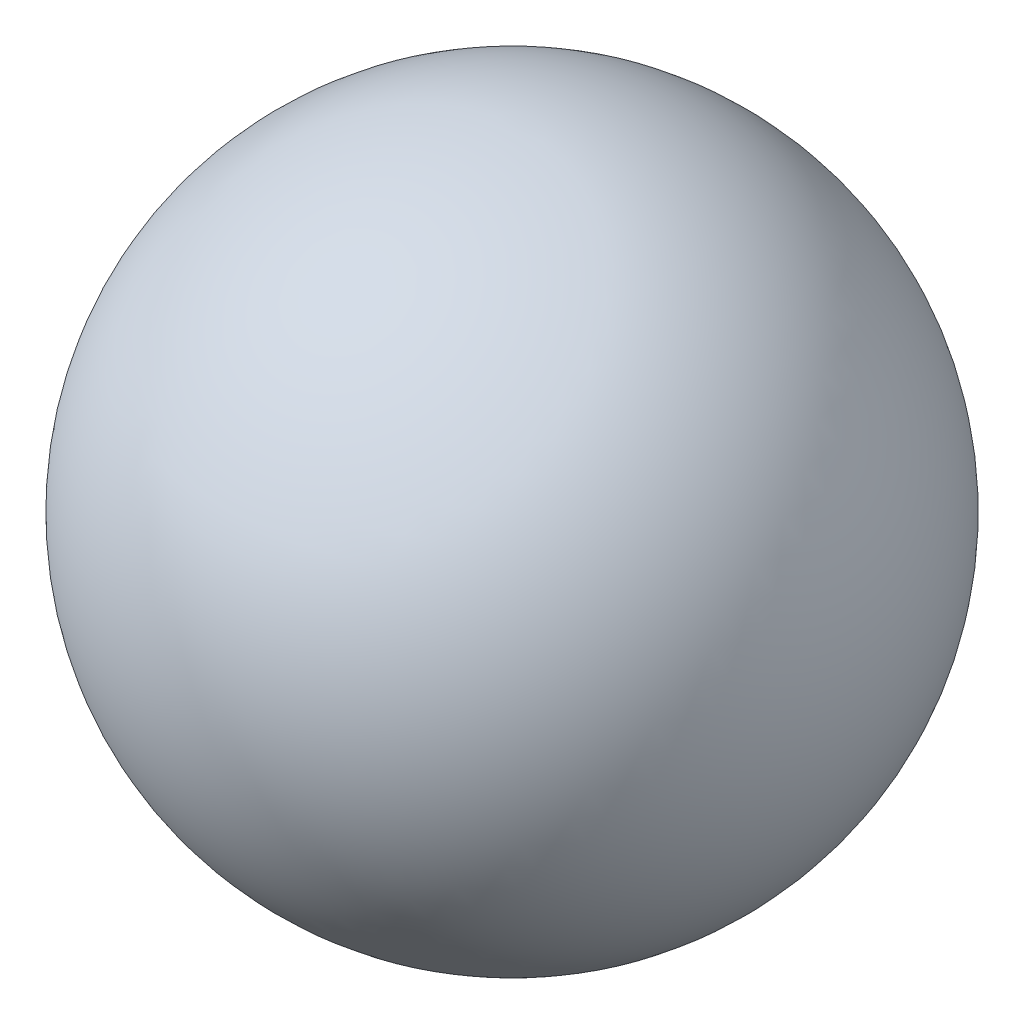
ISO-10303-21;
HEADER;
FILE_DESCRIPTION(('STEP AP214'),'2;1');
FILE_NAME('part.step','',(''),(''),'','','');
FILE_SCHEMA(('AUTOMOTIVE_DESIGN { 1 0 10303 214 1 1 1 1 }'));
ENDSEC;
DATA;
#1=APPLICATION_CONTEXT('core data for automotive mechanical design processes');
#2=APPLICATION_PROTOCOL_DEFINITION('international standard','automotive_design',2000,#1);
#3=PRODUCT_CONTEXT('',#1,'mechanical');
#4=PRODUCT('Part','Part','',(#3));
#5=PRODUCT_RELATED_PRODUCT_CATEGORY('part','',(#4));
#6=PRODUCT_DEFINITION_FORMATION('','',#4);
#7=PRODUCT_DEFINITION_CONTEXT('part definition',#1,'design');
#8=PRODUCT_DEFINITION('design','',#6,#7);
#9=PRODUCT_DEFINITION_SHAPE('','',#8);
#10=(LENGTH_UNIT() NAMED_UNIT(*) SI_UNIT(.MILLI.,.METRE.));
#11=(NAMED_UNIT(*) PLANE_ANGLE_UNIT() SI_UNIT($,.RADIAN.));
#12=(NAMED_UNIT(*) SI_UNIT($,.STERADIAN.) SOLID_ANGLE_UNIT());
#13=UNCERTAINTY_MEASURE_WITH_UNIT(LENGTH_MEASURE(1.E-05),#10,'distance_accuracy_value','');
#14=(GEOMETRIC_REPRESENTATION_CONTEXT(3) GLOBAL_UNCERTAINTY_ASSIGNED_CONTEXT((#13)) GLOBAL_UNIT_ASSIGNED_CONTEXT((#10,
#11,#12)) REPRESENTATION_CONTEXT('',''));
#15=CARTESIAN_POINT('',(0.,0.,0.));
#16=DIRECTION('',(0.,0.,1.));
#17=DIRECTION('',(1.,0.,0.));
#18=AXIS2_PLACEMENT_3D('',#15,#16,#17);
#19=CARTESIAN_POINT('',(0.,0.,0.));
#20=DIRECTION('',(0.,1.,0.));
#21=DIRECTION('',(1.,0.,0.));
#22=AXIS2_PLACEMENT_3D('',#19,#20,#21);
#23=SPHERICAL_SURFACE('',#22,165.1);
#24=CARTESIAN_POINT('',(0.,165.1,0.));
#25=VERTEX_POINT('',#24);
#26=VERTEX_LOOP('',#25);
#27=FACE_BOUND('',#26,.T.);
#28=ADVANCED_FACE('F34',(#27),#23,.T.);
#29=CLOSED_SHELL('',(#28));
#30=CARTESIAN_POINT('',(0.,0.,0.));
#31=DIRECTION('',(0.,1.,0.));
#32=DIRECTION('',(1.,0.,0.));
#33=AXIS2_PLACEMENT_3D('',#30,#31,#32);
#34=SPHERICAL_SURFACE('',#33,162.306);
#35=CARTESIAN_POINT('',(0.,162.306,0.));
#36=VERTEX_POINT('',#35);
#37=VERTEX_LOOP('',#36);
#38=FACE_BOUND('',#37,.T.);
#39=ADVANCED_FACE('F47',(#38),#34,.F.);
#40=CLOSED_SHELL('',(#39));
#41=ORIENTED_CLOSED_SHELL('',*,#40,.T.);
#42=BREP_WITH_VOIDS('B2',#29,(#41));
#43=ADVANCED_BREP_SHAPE_REPRESENTATION('',(#18,#42),#14);
#44=SHAPE_DEFINITION_REPRESENTATION(#9,#43);
ENDSEC;
END-ISO-10303-21;
